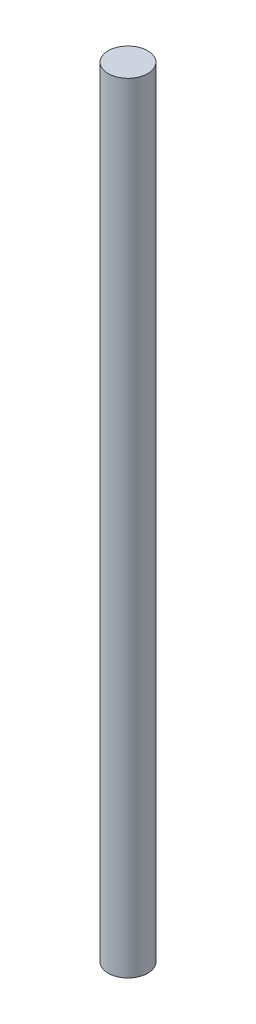
ISO-10303-21;
HEADER;
FILE_DESCRIPTION(('STEP AP214'),'2;1');
FILE_NAME('part.step','',(''),(''),'','','');
FILE_SCHEMA(('AUTOMOTIVE_DESIGN { 1 0 10303 214 1 1 1 1 }'));
ENDSEC;
DATA;
#1=APPLICATION_CONTEXT('core data for automotive mechanical design processes');
#2=APPLICATION_PROTOCOL_DEFINITION('international standard','automotive_design',2000,#1);
#3=PRODUCT_CONTEXT('',#1,'mechanical');
#4=PRODUCT('Part','Part','',(#3));
#5=PRODUCT_RELATED_PRODUCT_CATEGORY('part','',(#4));
#6=PRODUCT_DEFINITION_FORMATION('','',#4);
#7=PRODUCT_DEFINITION_CONTEXT('part definition',#1,'design');
#8=PRODUCT_DEFINITION('design','',#6,#7);
#9=PRODUCT_DEFINITION_SHAPE('','',#8);
#10=(LENGTH_UNIT() NAMED_UNIT(*) SI_UNIT(.MILLI.,.METRE.));
#11=(NAMED_UNIT(*) PLANE_ANGLE_UNIT() SI_UNIT($,.RADIAN.));
#12=(NAMED_UNIT(*) SI_UNIT($,.STERADIAN.) SOLID_ANGLE_UNIT());
#13=UNCERTAINTY_MEASURE_WITH_UNIT(LENGTH_MEASURE(1.E-05),#10,'distance_accuracy_value','');
#14=(GEOMETRIC_REPRESENTATION_CONTEXT(3) GLOBAL_UNCERTAINTY_ASSIGNED_CONTEXT((#13)) GLOBAL_UNIT_ASSIGNED_CONTEXT((#10,
#11,#12)) REPRESENTATION_CONTEXT('',''));
#15=CARTESIAN_POINT('',(0.,0.,0.));
#16=DIRECTION('',(0.,0.,1.));
#17=DIRECTION('',(1.,0.,0.));
#18=AXIS2_PLACEMENT_3D('',#15,#16,#17);
#19=CARTESIAN_POINT('',(0.,500.,0.));
#20=DIRECTION('',(0.,-1.,0.));
#21=DIRECTION('',(0.,0.,-1.));
#22=AXIS2_PLACEMENT_3D('',#19,#20,#21);
#23=CYLINDRICAL_SURFACE('',#22,12.7);
#24=CARTESIAN_POINT('',(0.,500.,0.));
#25=DIRECTION('',(0.,1.,0.));
#26=DIRECTION('',(0.,0.,1.));
#27=AXIS2_PLACEMENT_3D('',#24,#25,#26);
#28=CIRCLE('',#27,12.7);
#29=CARTESIAN_POINT('',(0.,500.,12.7));
#30=VERTEX_POINT('',#29);
#31=EDGE_CURVE('E10',#30,#30,#28,.T.);
#32=ORIENTED_EDGE('',*,*,#31,.F.);
#33=EDGE_LOOP('',(#32));
#34=FACE_BOUND('',#33,.T.);
#35=CARTESIAN_POINT('',(0.,0.,0.));
#36=DIRECTION('',(0.,1.,0.));
#37=DIRECTION('',(0.,0.,1.));
#38=AXIS2_PLACEMENT_3D('',#35,#36,#37);
#39=CIRCLE('',#38,12.7);
#40=CARTESIAN_POINT('',(0.,0.,12.7));
#41=VERTEX_POINT('',#40);
#42=EDGE_CURVE('E40',#41,#41,#39,.T.);
#43=ORIENTED_EDGE('',*,*,#42,.T.);
#44=EDGE_LOOP('',(#43));
#45=FACE_BOUND('',#44,.T.);
#46=ADVANCED_FACE('F37',(#34,#45),#23,.T.);
#47=CARTESIAN_POINT('',(0.,500.,0.));
#48=DIRECTION('',(0.,1.,0.));
#49=DIRECTION('',(0.,0.,1.));
#50=AXIS2_PLACEMENT_3D('',#47,#48,#49);
#51=PLANE('',#50);
#52=ORIENTED_EDGE('',*,*,#31,.T.);
#53=EDGE_LOOP('',(#52));
#54=FACE_BOUND('',#53,.T.);
#55=ADVANCED_FACE('F52',(#54),#51,.T.);
#56=CARTESIAN_POINT('',(0.,0.,0.));
#57=DIRECTION('',(0.,1.,0.));
#58=DIRECTION('',(0.,0.,1.));
#59=AXIS2_PLACEMENT_3D('',#56,#57,#58);
#60=PLANE('',#59);
#61=ORIENTED_EDGE('',*,*,#42,.F.);
#62=EDGE_LOOP('',(#61));
#63=FACE_BOUND('',#62,.T.);
#64=ADVANCED_FACE('F50',(#63),#60,.F.);
#65=CLOSED_SHELL('',(#46,#55,#64));
#66=MANIFOLD_SOLID_BREP('B2',#65);
#67=ADVANCED_BREP_SHAPE_REPRESENTATION('',(#18,#66),#14);
#68=SHAPE_DEFINITION_REPRESENTATION(#9,#67);
ENDSEC;
END-ISO-10303-21;
